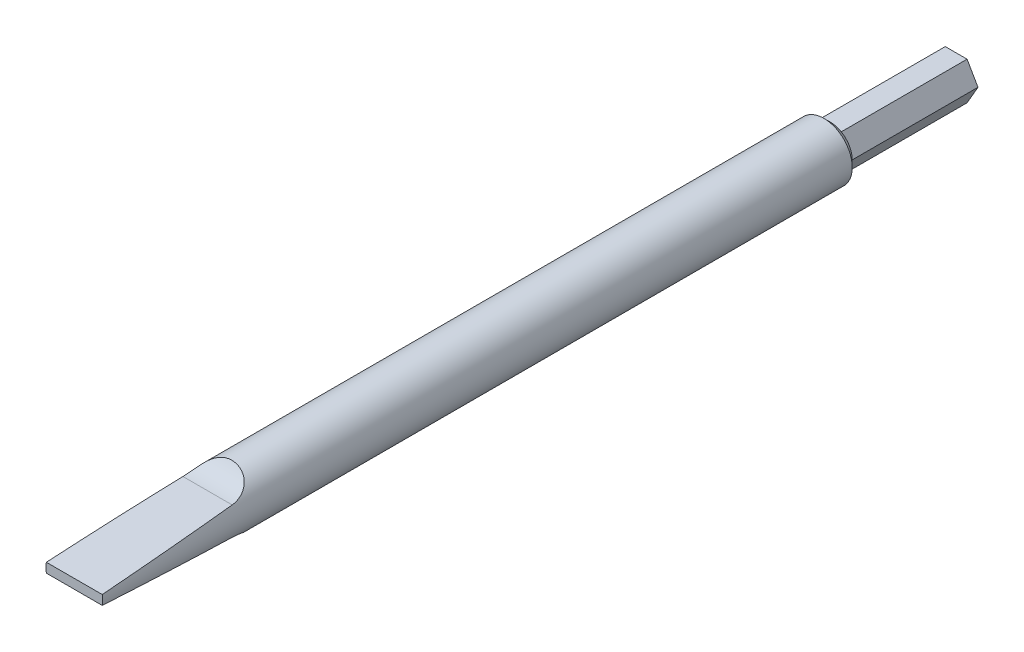
ISO-10303-21;
HEADER;
FILE_DESCRIPTION(('STEP AP214'),'2;1');
FILE_NAME('part.step','',(''),(''),'','','');
FILE_SCHEMA(('AUTOMOTIVE_DESIGN { 1 0 10303 214 1 1 1 1 }'));
ENDSEC;
DATA;
#1=APPLICATION_CONTEXT('core data for automotive mechanical design processes');
#2=APPLICATION_PROTOCOL_DEFINITION('international standard','automotive_design',2000,#1);
#3=PRODUCT_CONTEXT('',#1,'mechanical');
#4=PRODUCT('Part','Part','',(#3));
#5=PRODUCT_RELATED_PRODUCT_CATEGORY('part','',(#4));
#6=PRODUCT_DEFINITION_FORMATION('','',#4);
#7=PRODUCT_DEFINITION_CONTEXT('part definition',#1,'design');
#8=PRODUCT_DEFINITION('design','',#6,#7);
#9=PRODUCT_DEFINITION_SHAPE('','',#8);
#10=(LENGTH_UNIT() NAMED_UNIT(*) SI_UNIT(.MILLI.,.METRE.));
#11=(NAMED_UNIT(*) PLANE_ANGLE_UNIT() SI_UNIT($,.RADIAN.));
#12=(NAMED_UNIT(*) SI_UNIT($,.STERADIAN.) SOLID_ANGLE_UNIT());
#13=UNCERTAINTY_MEASURE_WITH_UNIT(LENGTH_MEASURE(1.E-05),#10,'distance_accuracy_value','');
#14=(GEOMETRIC_REPRESENTATION_CONTEXT(3) GLOBAL_UNCERTAINTY_ASSIGNED_CONTEXT((#13)) GLOBAL_UNIT_ASSIGNED_CONTEXT((#10,
#11,#12)) REPRESENTATION_CONTEXT('',''));
#15=CARTESIAN_POINT('',(0.,0.,0.));
#16=DIRECTION('',(0.,0.,1.));
#17=DIRECTION('',(1.,0.,0.));
#18=AXIS2_PLACEMENT_3D('',#15,#16,#17);
#19=CARTESIAN_POINT('',(0.,0.,120.));
#20=DIRECTION('',(0.,0.,-1.));
#21=DIRECTION('',(-1.,0.,0.));
#22=AXIS2_PLACEMENT_3D('',#19,#20,#21);
#23=CYLINDRICAL_SURFACE('',#22,4.5);
#24=CARTESIAN_POINT('',(0.,0.,1.));
#25=DIRECTION('',(0.,0.,1.));
#26=DIRECTION('',(1.,0.,0.));
#27=AXIS2_PLACEMENT_3D('',#24,#25,#26);
#28=CIRCLE('',#27,4.5);
#29=CARTESIAN_POINT('',(4.5,0.,1.));
#30=VERTEX_POINT('',#29);
#31=EDGE_CURVE('E182',#30,#30,#28,.T.);
#32=ORIENTED_EDGE('',*,*,#31,.T.);
#33=EDGE_LOOP('',(#32));
#34=FACE_BOUND('',#33,.T.);
#35=CARTESIAN_POINT('',(-3.90913794443008,-2.22904475760739,98.8486745427175));
#36=CARTESIAN_POINT('',(-3.90455301412368,-2.23702621646611,98.7342787867654));
#37=CARTESIAN_POINT('',(-3.89774124246853,-2.24897237830166,98.6202409171083));
#38=CARTESIAN_POINT('',(-3.87934716952942,-2.28058564520321,98.3935946749973));
#39=CARTESIAN_POINT('',(-3.86776339242702,-2.30025513874391,98.280986755894));
#40=CARTESIAN_POINT('',(-3.83945395370796,-2.34719584400133,98.0575363098172));
#41=CARTESIAN_POINT('',(-3.82270774842751,-2.37449738593554,97.9467027315231));
#42=CARTESIAN_POINT('',(-3.78362142886619,-2.436298436684,97.7280755292207));
#43=CARTESIAN_POINT('',(-3.76128183711757,-2.47079727307929,97.6202816222934));
#44=CARTESIAN_POINT('',(-3.71037687082037,-2.54660406210751,97.4082165609079));
#45=CARTESIAN_POINT('',(-3.68179205909014,-2.5879331727381,97.3039576056024));
#46=CARTESIAN_POINT('',(-3.61783051026291,-2.67661907337466,97.1001945116027));
#47=CARTESIAN_POINT('',(-3.58245433848763,-2.72397536155994,97.0006899780045));
#48=CARTESIAN_POINT('',(-3.50439309765484,-2.8236902240112,96.8075192575303));
#49=CARTESIAN_POINT('',(-3.46172484722608,-2.87603716753399,96.7138402977946));
#50=CARTESIAN_POINT('',(-3.36849906138687,-2.9846830410643,96.5329182426583));
#51=CARTESIAN_POINT('',(-3.31794236581186,-3.0409815500217,96.445674463597));
#52=CARTESIAN_POINT('',(-3.2123516689926,-3.15218326142481,96.2841591543176));
#53=CARTESIAN_POINT('',(-3.15786937601235,-3.20691354791847,96.2094077407047));
#54=CARTESIAN_POINT('',(-3.04161662066168,-3.31737747759323,96.0666193508308));
#55=CARTESIAN_POINT('',(-2.97984690966111,-3.37311101683262,95.9985816836744));
#56=CARTESIAN_POINT('',(-2.84907936053104,-3.48426592602755,95.8695508433399));
#57=CARTESIAN_POINT('',(-2.78008114230142,-3.53968727940563,95.8085580409603));
#58=CARTESIAN_POINT('',(-2.6351337042114,-3.64887642748707,95.6937825954873));
#59=CARTESIAN_POINT('',(-2.55918489021543,-3.70264431849602,95.6399995318489));
#60=CARTESIAN_POINT('',(-2.40814230508481,-3.80240311983273,95.5442692448825));
#61=CARTESIAN_POINT('',(-2.33362025159587,-3.84865318926925,95.5016872490807));
#62=CARTESIAN_POINT('',(-2.17966921272709,-3.93788764806116,95.4222911569372));
#63=CARTESIAN_POINT('',(-2.10023867309235,-3.98087099331313,95.3854789007471));
#64=CARTESIAN_POINT('',(-1.93704749879922,-4.06277994182616,95.3174332764952));
#65=CARTESIAN_POINT('',(-1.85328791148238,-4.10170651974433,95.2861985671095));
#66=CARTESIAN_POINT('',(-1.68196842738293,-4.17488472425591,95.229017157265));
#67=CARTESIAN_POINT('',(-1.59440708697675,-4.20913455413967,95.2030724872524));
#68=CARTESIAN_POINT('',(-1.4150627178379,-4.27279286567596,95.1559191061295));
#69=CARTESIAN_POINT('',(-1.32324199674026,-4.30213927068602,95.1347700620595));
#70=CARTESIAN_POINT('',(-1.13696065361347,-4.35507754079025,95.0973075393073));
#71=CARTESIAN_POINT('',(-1.04249914270451,-4.37866744162889,95.0809957107901));
#72=CARTESIAN_POINT('',(-0.851591587608721,-4.41976539080912,95.0529601985634));
#73=CARTESIAN_POINT('',(-0.755145476548751,-4.43727323385288,95.0412366697288));
#74=CARTESIAN_POINT('',(-0.560890393805394,-4.46598738167682,95.0221761964408));
#75=CARTESIAN_POINT('',(-0.463081368735668,-4.47719343889635,95.0148394243169));
#76=CARTESIAN_POINT('',(-0.261310371063095,-4.49360841061999,95.0041316886795));
#77=CARTESIAN_POINT('',(-0.157305834671434,-4.49845362158803,95.001001013529));
#78=CARTESIAN_POINT('',(0.050791249955018,-4.50091605877074,94.9994070035386));
#79=CARTESIAN_POINT('',(0.154883761930243,-4.49853547669683,95.0009422534408));
#80=CARTESIAN_POINT('',(0.362541163810523,-4.48657840402763,95.0087117525025));
#81=CARTESIAN_POINT('',(0.466105708581934,-4.47699769520908,95.0149487562099));
#82=CARTESIAN_POINT('',(0.671888596740988,-4.45076624447432,95.0322505562378));
#83=CARTESIAN_POINT('',(0.774107437997058,-4.43411819762719,95.0433135122668));
#84=CARTESIAN_POINT('',(0.978376392649346,-4.39361106688484,95.0707334624376));
#85=CARTESIAN_POINT('',(1.08038886357047,-4.36962505271901,95.0871840351622));
#86=CARTESIAN_POINT('',(1.28148931228229,-4.3149320162795,95.1256145106216));
#87=CARTESIAN_POINT('',(1.38057841172096,-4.28422761082077,95.1475922610158));
#88=CARTESIAN_POINT('',(1.57507265805744,-4.21660333411223,95.1974328302393));
#89=CARTESIAN_POINT('',(1.6704784246735,-4.1796845140855,95.2252946539282));
#90=CARTESIAN_POINT('',(1.8568426085362,-4.1002917134688,95.287277239646));
#91=CARTESIAN_POINT('',(1.94780125029293,-4.05781801371184,95.3213976852984));
#92=CARTESIAN_POINT('',(2.12126105031413,-3.96980587526507,95.3948568070534));
#93=CARTESIAN_POINT('',(2.20395054168733,-3.92443872232139,95.4339560171983));
#94=CARTESIAN_POINT('',(2.36394116852969,-3.8301963641651,95.5185327371687));
#95=CARTESIAN_POINT('',(2.44124045890579,-3.7813199692283,95.5640124151713));
#96=CARTESIAN_POINT('',(2.58984633123179,-3.68113041341151,95.6614341851423));
#97=CARTESIAN_POINT('',(2.66115775490605,-3.62981927482606,95.7133709699943));
#98=CARTESIAN_POINT('',(2.79750455439799,-3.52580828649944,95.8237571580949));
#99=CARTESIAN_POINT('',(2.86253769658988,-3.4731079509501,95.8822088633403));
#100=CARTESIAN_POINT('',(2.98297651089297,-3.37013542649679,96.0023647883848));
#101=CARTESIAN_POINT('',(3.03870143596111,-3.31987400410266,96.0637589014692));
#102=CARTESIAN_POINT('',(3.14423550741772,-3.22010235349993,96.1920464231747));
#103=CARTESIAN_POINT('',(3.19404255062078,-3.17059239777905,96.2589417727002));
#104=CARTESIAN_POINT('',(3.28779056711402,-3.07327174497449,96.3978454439556));
#105=CARTESIAN_POINT('',(3.33173282550277,-3.02546067731882,96.4698526402567));
#106=CARTESIAN_POINT('',(3.41397726201645,-2.93234054623073,96.6185905027541));
#107=CARTESIAN_POINT('',(3.45227737571842,-2.88703240237242,96.6953228833739));
#108=CARTESIAN_POINT('',(3.52457291290428,-2.79834911591695,96.855377294842));
#109=CARTESIAN_POINT('',(3.55840449081346,-2.75507290609889,96.9388280265469));
#110=CARTESIAN_POINT('',(3.62074796646077,-2.67261260417686,97.109689319816));
#111=CARTESIAN_POINT('',(3.64925750881822,-2.63343032729214,97.1971016134856));
#112=CARTESIAN_POINT('',(3.70134563535071,-2.55970296754422,97.3753297429375));
#113=CARTESIAN_POINT('',(3.72492197992573,-2.52515999339455,97.4661471026037));
#114=CARTESIAN_POINT('',(3.76751692246678,-2.46115721426346,97.6505978419934));
#115=CARTESIAN_POINT('',(3.7865354465755,-2.43169749165585,97.7442312673222));
#116=CARTESIAN_POINT('',(3.81804381376264,-2.38186601038426,97.9207414664065));
#117=CARTESIAN_POINT('',(3.83107165117266,-2.36080172872799,98.0033285244547));
#118=CARTESIAN_POINT('',(3.85419730016856,-2.32285508466957,98.1698579279807));
#119=CARTESIAN_POINT('',(3.86429528366966,-2.30597247690759,98.2538001936336));
#120=CARTESIAN_POINT('',(3.88170608285833,-2.27654460459327,98.4225084552288));
#121=CARTESIAN_POINT('',(3.88902574489354,-2.26398868533907,98.5072718914801));
#122=CARTESIAN_POINT('',(3.90102964912072,-2.24323185058371,98.6775140433748));
#123=CARTESIAN_POINT('',(3.90571394949778,-2.23503083893253,98.7629927431838));
#124=CARTESIAN_POINT('',(3.90913794443008,-2.22904475760738,98.8486745427175));
#125=B_SPLINE_CURVE_WITH_KNOTS('',3,(#35,#36,#37,#38,#39,#40,#41,#42,#43,#44,#45,#46,#47,#48,
#49,#50,#51,#52,#53,#54,#55,#56,#57,#58,#59,#60,#61,#62,#63,#64,#65,#66,#67,#68,#69,#70,#71,#72,
#73,#74,#75,#76,#77,#78,#79,#80,#81,#82,#83,#84,#85,#86,#87,#88,#89,#90,#91,#92,#93,#94,#95,#96,
#97,#98,#99,#100,#101,#102,#103,#104,#105,#106,#107,#108,#109,#110,#111,#112,#113,#114,#115,
#116,#117,#118,#119,#120,#121,#122,#123,#124),.UNSPECIFIED.,.F.,.F.,(4,2,2,2,2,2,2,2,2,2,2,2,2,
2,2,2,2,2,2,2,2,2,2,2,2,2,2,2,2,2,2,2,2,2,2,2,2,2,2,2,2,2,2,2,4),(0.,0.344218673375672,
0.688543881854524,1.03425740296899,1.37993863968712,1.7267114781845,2.07345546336158,
2.41941024420027,2.76532821840729,3.08731527466596,3.40926916138795,3.7312399860742,
4.05319202197876,4.34533978740256,4.63758053917147,4.9297509160951,5.22203322490096,
5.51777376437477,5.81361507685571,6.10946637439177,6.40532929339913,6.71746313275976,
7.02950230584357,7.34172443098342,7.65382759968232,7.97166795893523,8.28938473897319,
8.60704782832532,8.92469486407721,9.23060206706399,9.53661347476197,9.84237501312737,
10.1482449345382,10.4387759573691,10.7294099265599,11.0199801067686,11.3106563419917,
11.6100631974403,11.909602249263,12.2092769938196,12.5089565941335,12.7674602840362,
13.0259488026335,13.283796152694,13.5416378096236),.UNSPECIFIED.);
#126=CARTESIAN_POINT('',(-3.90913794443008,-2.22904475760739,98.8486745427175));
#127=VERTEX_POINT('',#126);
#128=CARTESIAN_POINT('',(3.90913794443008,-2.22904475760739,98.8486745427175));
#129=VERTEX_POINT('',#128);
#130=EDGE_CURVE('E11',#127,#129,#125,.T.);
#131=ORIENTED_EDGE('',*,*,#130,.F.);
#132=CARTESIAN_POINT('',(0.,0.,130.725499692534));
#133=DIRECTION('',(0.,0.997564050259824,-0.0697564737441254));
#134=DIRECTION('',(0.,-0.0697564737441254,-0.997564050259824));
#135=AXIS2_PLACEMENT_3D('',#132,#133,#134);
#136=ELLIPSE('',#135,64.5101416179164,4.5);
#137=CARTESIAN_POINT('',(-4.43705983732472,-0.75,120.));
#138=VERTEX_POINT('',#137);
#139=EDGE_CURVE('E246',#127,#138,#136,.T.);
#140=ORIENTED_EDGE('',*,*,#139,.T.);
#141=CARTESIAN_POINT('',(0.,0.,120.));
#142=DIRECTION('',(0.,0.,1.));
#143=DIRECTION('',(1.,0.,0.));
#144=AXIS2_PLACEMENT_3D('',#141,#142,#143);
#145=CIRCLE('',#144,4.5);
#146=CARTESIAN_POINT('',(-4.43705983732472,0.75,120.));
#147=VERTEX_POINT('',#146);
#148=EDGE_CURVE('E161',#147,#138,#145,.T.);
#149=ORIENTED_EDGE('',*,*,#148,.F.);
#150=CARTESIAN_POINT('',(0.,0.,130.725499692534));
#151=DIRECTION('',(0.,0.997564050259824,0.0697564737441254));
#152=DIRECTION('',(0.,0.0697564737441255,-0.997564050259824));
#153=AXIS2_PLACEMENT_3D('',#150,#151,#152);
#154=ELLIPSE('',#153,64.5101416179164,4.5);
#155=CARTESIAN_POINT('',(-3.90913794443008,2.22904475760739,98.8486745427175));
#156=VERTEX_POINT('',#155);
#157=EDGE_CURVE('E272',#156,#147,#154,.T.);
#158=ORIENTED_EDGE('',*,*,#157,.F.);
#159=CARTESIAN_POINT('',(-3.90913794443008,2.22904475760739,98.8486745427175));
#160=CARTESIAN_POINT('',(-3.90455301412368,2.23702621646611,98.7342787867654));
#161=CARTESIAN_POINT('',(-3.89774124246853,2.24897237830166,98.6202409171083));
#162=CARTESIAN_POINT('',(-3.87934716952942,2.28058564520321,98.3935946749973));
#163=CARTESIAN_POINT('',(-3.86776339242702,2.30025513874391,98.280986755894));
#164=CARTESIAN_POINT('',(-3.83945395370796,2.34719584400133,98.0575363098172));
#165=CARTESIAN_POINT('',(-3.82270774842751,2.37449738593554,97.9467027315231));
#166=CARTESIAN_POINT('',(-3.78362142886619,2.436298436684,97.7280755292207));
#167=CARTESIAN_POINT('',(-3.76128183711757,2.47079727307929,97.6202816222934));
#168=CARTESIAN_POINT('',(-3.71037687082037,2.54660406210751,97.4082165609079));
#169=CARTESIAN_POINT('',(-3.68179205909014,2.5879331727381,97.3039576056024));
#170=CARTESIAN_POINT('',(-3.61783051026291,2.67661907337466,97.1001945116027));
#171=CARTESIAN_POINT('',(-3.58245433848763,2.72397536155994,97.0006899780045));
#172=CARTESIAN_POINT('',(-3.50439309765484,2.8236902240112,96.8075192575303));
#173=CARTESIAN_POINT('',(-3.46172484722608,2.87603716753399,96.7138402977946));
#174=CARTESIAN_POINT('',(-3.36849906138687,2.9846830410643,96.5329182426583));
#175=CARTESIAN_POINT('',(-3.31794236581186,3.0409815500217,96.445674463597));
#176=CARTESIAN_POINT('',(-3.2123516689926,3.15218326142481,96.2841591543176));
#177=CARTESIAN_POINT('',(-3.15786937601235,3.20691354791847,96.2094077407047));
#178=CARTESIAN_POINT('',(-3.04161662066168,3.31737747759323,96.0666193508308));
#179=CARTESIAN_POINT('',(-2.97984690966111,3.37311101683262,95.9985816836744));
#180=CARTESIAN_POINT('',(-2.84907936053104,3.48426592602755,95.8695508433399));
#181=CARTESIAN_POINT('',(-2.78008114230142,3.53968727940563,95.8085580409603));
#182=CARTESIAN_POINT('',(-2.6351337042114,3.64887642748707,95.6937825954873));
#183=CARTESIAN_POINT('',(-2.55918489021543,3.70264431849602,95.6399995318489));
#184=CARTESIAN_POINT('',(-2.40814230508481,3.80240311983273,95.5442692448825));
#185=CARTESIAN_POINT('',(-2.33362025159587,3.84865318926925,95.5016872490807));
#186=CARTESIAN_POINT('',(-2.17966921272709,3.93788764806116,95.4222911569372));
#187=CARTESIAN_POINT('',(-2.10023867309235,3.98087099331313,95.3854789007471));
#188=CARTESIAN_POINT('',(-1.93704749879922,4.06277994182616,95.3174332764952));
#189=CARTESIAN_POINT('',(-1.85328791148238,4.10170651974433,95.2861985671095));
#190=CARTESIAN_POINT('',(-1.68196842738293,4.17488472425591,95.229017157265));
#191=CARTESIAN_POINT('',(-1.59440708697675,4.20913455413967,95.2030724872524));
#192=CARTESIAN_POINT('',(-1.4150627178379,4.27279286567596,95.1559191061295));
#193=CARTESIAN_POINT('',(-1.32324199674026,4.30213927068602,95.1347700620595));
#194=CARTESIAN_POINT('',(-1.13696065361347,4.35507754079025,95.0973075393073));
#195=CARTESIAN_POINT('',(-1.04249914270451,4.37866744162889,95.0809957107901));
#196=CARTESIAN_POINT('',(-0.851591587608721,4.41976539080912,95.0529601985634));
#197=CARTESIAN_POINT('',(-0.755145476548751,4.43727323385288,95.0412366697288));
#198=CARTESIAN_POINT('',(-0.560890393805394,4.46598738167682,95.0221761964408));
#199=CARTESIAN_POINT('',(-0.463081368735668,4.47719343889635,95.0148394243169));
#200=CARTESIAN_POINT('',(-0.261310371063095,4.49360841061999,95.0041316886795));
#201=CARTESIAN_POINT('',(-0.157305834671434,4.49845362158803,95.001001013529));
#202=CARTESIAN_POINT('',(0.050791249955018,4.50091605877074,94.9994070035386));
#203=CARTESIAN_POINT('',(0.154883761930243,4.49853547669683,95.0009422534408));
#204=CARTESIAN_POINT('',(0.362541163810523,4.48657840402763,95.0087117525025));
#205=CARTESIAN_POINT('',(0.466105708581934,4.47699769520908,95.0149487562099));
#206=CARTESIAN_POINT('',(0.671888596740988,4.45076624447432,95.0322505562378));
#207=CARTESIAN_POINT('',(0.774107437997058,4.43411819762719,95.0433135122668));
#208=CARTESIAN_POINT('',(0.978376392649346,4.39361106688484,95.0707334624376));
#209=CARTESIAN_POINT('',(1.08038886357047,4.36962505271901,95.0871840351622));
#210=CARTESIAN_POINT('',(1.28148931228229,4.3149320162795,95.1256145106216));
#211=CARTESIAN_POINT('',(1.38057841172096,4.28422761082077,95.1475922610158));
#212=CARTESIAN_POINT('',(1.57507265805744,4.21660333411223,95.1974328302393));
#213=CARTESIAN_POINT('',(1.6704784246735,4.1796845140855,95.2252946539282));
#214=CARTESIAN_POINT('',(1.8568426085362,4.1002917134688,95.287277239646));
#215=CARTESIAN_POINT('',(1.94780125029293,4.05781801371184,95.3213976852984));
#216=CARTESIAN_POINT('',(2.12126105031413,3.96980587526507,95.3948568070534));
#217=CARTESIAN_POINT('',(2.20395054168733,3.92443872232139,95.4339560171983));
#218=CARTESIAN_POINT('',(2.36394116852969,3.8301963641651,95.5185327371687));
#219=CARTESIAN_POINT('',(2.44124045890579,3.7813199692283,95.5640124151713));
#220=CARTESIAN_POINT('',(2.58984633123179,3.68113041341151,95.6614341851423));
#221=CARTESIAN_POINT('',(2.66115775490605,3.62981927482606,95.7133709699943));
#222=CARTESIAN_POINT('',(2.79750455439799,3.52580828649944,95.8237571580949));
#223=CARTESIAN_POINT('',(2.86253769658988,3.4731079509501,95.8822088633403));
#224=CARTESIAN_POINT('',(2.98297651089297,3.37013542649679,96.0023647883848));
#225=CARTESIAN_POINT('',(3.03870143596111,3.31987400410266,96.0637589014692));
#226=CARTESIAN_POINT('',(3.14423550741772,3.22010235349993,96.1920464231747));
#227=CARTESIAN_POINT('',(3.19404255062078,3.17059239777905,96.2589417727002));
#228=CARTESIAN_POINT('',(3.28779056711402,3.07327174497449,96.3978454439556));
#229=CARTESIAN_POINT('',(3.33173282550277,3.02546067731882,96.4698526402567));
#230=CARTESIAN_POINT('',(3.41397726201645,2.93234054623073,96.6185905027541));
#231=CARTESIAN_POINT('',(3.45227737571842,2.88703240237242,96.6953228833739));
#232=CARTESIAN_POINT('',(3.52457291290428,2.79834911591695,96.855377294842));
#233=CARTESIAN_POINT('',(3.55840449081346,2.75507290609889,96.9388280265469));
#234=CARTESIAN_POINT('',(3.62074796646077,2.67261260417686,97.109689319816));
#235=CARTESIAN_POINT('',(3.64925750881822,2.63343032729214,97.1971016134856));
#236=CARTESIAN_POINT('',(3.70134563535071,2.55970296754422,97.3753297429375));
#237=CARTESIAN_POINT('',(3.72492197992573,2.52515999339455,97.4661471026037));
#238=CARTESIAN_POINT('',(3.76751692246678,2.46115721426346,97.6505978419934));
#239=CARTESIAN_POINT('',(3.7865354465755,2.43169749165585,97.7442312673222));
#240=CARTESIAN_POINT('',(3.81804381376264,2.38186601038426,97.9207414664065));
#241=CARTESIAN_POINT('',(3.83107165117266,2.36080172872799,98.0033285244547));
#242=CARTESIAN_POINT('',(3.85419730016856,2.32285508466957,98.1698579279807));
#243=CARTESIAN_POINT('',(3.86429528366966,2.30597247690759,98.2538001936336));
#244=CARTESIAN_POINT('',(3.88170608285833,2.27654460459327,98.4225084552288));
#245=CARTESIAN_POINT('',(3.88902574489354,2.26398868533907,98.5072718914801));
#246=CARTESIAN_POINT('',(3.90102964912072,2.24323185058371,98.6775140433748));
#247=CARTESIAN_POINT('',(3.90571394949778,2.23503083893253,98.7629927431838));
#248=CARTESIAN_POINT('',(3.90913794443008,2.22904475760738,98.8486745427175));
#249=B_SPLINE_CURVE_WITH_KNOTS('',3,(#159,#160,#161,#162,#163,#164,#165,#166,#167,#168,#169,
#170,#171,#172,#173,#174,#175,#176,#177,#178,#179,#180,#181,#182,#183,#184,#185,#186,#187,#188,
#189,#190,#191,#192,#193,#194,#195,#196,#197,#198,#199,#200,#201,#202,#203,#204,#205,#206,#207,
#208,#209,#210,#211,#212,#213,#214,#215,#216,#217,#218,#219,#220,#221,#222,#223,#224,#225,#226,
#227,#228,#229,#230,#231,#232,#233,#234,#235,#236,#237,#238,#239,#240,#241,#242,#243,#244,#245,
#246,#247,#248),.UNSPECIFIED.,.F.,.F.,(4,2,2,2,2,2,2,2,2,2,2,2,2,2,2,2,2,2,2,2,2,2,2,2,2,2,2,2,
2,2,2,2,2,2,2,2,2,2,2,2,2,2,2,2,4),(0.,0.344218673375672,0.688543881854524,1.03425740296899,
1.37993863968712,1.7267114781845,2.07345546336158,2.41941024420027,2.76532821840729,
3.08731527466596,3.40926916138795,3.7312399860742,4.05319202197876,4.34533978740256,
4.63758053917147,4.9297509160951,5.22203322490096,5.51777376437477,5.81361507685571,
6.10946637439177,6.40532929339913,6.71746313275976,7.02950230584357,7.34172443098342,
7.65382759968232,7.97166795893523,8.28938473897319,8.60704782832532,8.92469486407721,
9.23060206706399,9.53661347476197,9.84237501312737,10.1482449345382,10.4387759573691,
10.7294099265599,11.0199801067686,11.3106563419917,11.6100631974403,11.909602249263,
12.2092769938196,12.5089565941335,12.7674602840362,13.0259488026335,13.283796152694,
13.5416378096236),.UNSPECIFIED.);
#250=CARTESIAN_POINT('',(3.90913794443008,2.22904475760739,98.8486745427175));
#251=VERTEX_POINT('',#250);
#252=EDGE_CURVE('E63',#156,#251,#249,.T.);
#253=ORIENTED_EDGE('',*,*,#252,.T.);
#254=CARTESIAN_POINT('',(4.43705983732472,0.75,120.));
#255=VERTEX_POINT('',#254);
#256=EDGE_CURVE('E270',#255,#251,#154,.T.);
#257=ORIENTED_EDGE('',*,*,#256,.F.);
#258=CARTESIAN_POINT('',(4.43705983732472,-0.75,120.));
#259=VERTEX_POINT('',#258);
#260=EDGE_CURVE('E262',#259,#255,#145,.T.);
#261=ORIENTED_EDGE('',*,*,#260,.F.);
#262=EDGE_CURVE('E252',#259,#129,#136,.T.);
#263=ORIENTED_EDGE('',*,*,#262,.T.);
#264=EDGE_LOOP('',(#131,#140,#149,#158,#253,#257,#261,#263));
#265=FACE_BOUND('',#264,.T.);
#266=ADVANCED_FACE('F47',(#34,#265),#23,.T.);
#267=CARTESIAN_POINT('',(0.,0.,120.));
#268=DIRECTION('',(0.,0.,1.));
#269=DIRECTION('',(1.,0.,0.));
#270=AXIS2_PLACEMENT_3D('',#267,#268,#269);
#271=PLANE('',#270);
#272=DIRECTION('',(-1.,0.,0.));
#273=VECTOR('',#272,1.);
#274=CARTESIAN_POINT('',(120.,-0.75,120.));
#275=LINE('',#274,#273);
#276=EDGE_CURVE('E210',#259,#138,#275,.T.);
#277=ORIENTED_EDGE('',*,*,#276,.F.);
#278=ORIENTED_EDGE('',*,*,#260,.T.);
#279=DIRECTION('',(-1.,0.,0.));
#280=VECTOR('',#279,1.);
#281=CARTESIAN_POINT('',(120.,0.75,120.));
#282=LINE('',#281,#280);
#283=EDGE_CURVE('E198',#255,#147,#282,.T.);
#284=ORIENTED_EDGE('',*,*,#283,.T.);
#285=ORIENTED_EDGE('',*,*,#148,.T.);
#286=EDGE_LOOP('',(#277,#278,#284,#285));
#287=FACE_BOUND('',#286,.T.);
#288=ADVANCED_FACE('F217',(#287),#271,.T.);
#289=CARTESIAN_POINT('',(2.59807621135332,-1.5,-20.));
#290=DIRECTION('',(0.866025403784439,-0.5,0.));
#291=DIRECTION('',(0.5,0.866025403784439,0.));
#292=AXIS2_PLACEMENT_3D('',#289,#290,#291);
#293=PLANE('',#292);
#294=DIRECTION('',(0.5,0.866025403784439,0.));
#295=VECTOR('',#294,1.);
#296=CARTESIAN_POINT('',(2.59807621135332,-1.5,0.));
#297=LINE('',#296,#295);
#298=CARTESIAN_POINT('',(1.73205080756888,-3.,0.));
#299=VERTEX_POINT('',#298);
#300=CARTESIAN_POINT('',(3.46410161513775,0.,0.));
#301=VERTEX_POINT('',#300);
#302=EDGE_CURVE('E158',#299,#301,#297,.T.);
#303=ORIENTED_EDGE('',*,*,#302,.F.);
#304=DIRECTION('',(0.,0.,1.));
#305=VECTOR('',#304,1.);
#306=CARTESIAN_POINT('',(1.73205080756888,-3.,-20.));
#307=LINE('',#306,#305);
#308=CARTESIAN_POINT('',(1.73205080756888,-3.,-20.));
#309=VERTEX_POINT('',#308);
#310=EDGE_CURVE('E78',#309,#299,#307,.T.);
#311=ORIENTED_EDGE('',*,*,#310,.F.);
#312=DIRECTION('',(0.5,0.866025403784439,0.));
#313=VECTOR('',#312,1.);
#314=CARTESIAN_POINT('',(2.59807621135332,-1.5,-20.));
#315=LINE('',#314,#313);
#316=CARTESIAN_POINT('',(3.46410161513775,0.,-20.));
#317=VERTEX_POINT('',#316);
#318=EDGE_CURVE('E179',#309,#317,#315,.T.);
#319=ORIENTED_EDGE('',*,*,#318,.T.);
#320=DIRECTION('',(0.,0.,1.));
#321=VECTOR('',#320,1.);
#322=CARTESIAN_POINT('',(3.46410161513775,0.,-20.));
#323=LINE('',#322,#321);
#324=EDGE_CURVE('E113',#317,#301,#323,.T.);
#325=ORIENTED_EDGE('',*,*,#324,.T.);
#326=EDGE_LOOP('',(#303,#311,#319,#325));
#327=FACE_BOUND('',#326,.T.);
#328=ADVANCED_FACE('F219',(#327),#293,.T.);
#329=CARTESIAN_POINT('',(0.,-3.,-20.));
#330=DIRECTION('',(0.,-1.,0.));
#331=DIRECTION('',(0.,0.,-1.));
#332=AXIS2_PLACEMENT_3D('',#329,#330,#331);
#333=PLANE('',#332);
#334=DIRECTION('',(1.,0.,0.));
#335=VECTOR('',#334,1.);
#336=CARTESIAN_POINT('',(0.,-3.,0.));
#337=LINE('',#336,#335);
#338=CARTESIAN_POINT('',(-1.73205080756887,-3.,0.));
#339=VERTEX_POINT('',#338);
#340=EDGE_CURVE('E176',#339,#299,#337,.T.);
#341=ORIENTED_EDGE('',*,*,#340,.F.);
#342=DIRECTION('',(0.,0.,1.));
#343=VECTOR('',#342,1.);
#344=CARTESIAN_POINT('',(-1.73205080756887,-3.,-20.));
#345=LINE('',#344,#343);
#346=CARTESIAN_POINT('',(-1.73205080756887,-3.,-20.));
#347=VERTEX_POINT('',#346);
#348=EDGE_CURVE('E102',#347,#339,#345,.T.);
#349=ORIENTED_EDGE('',*,*,#348,.F.);
#350=DIRECTION('',(1.,0.,0.));
#351=VECTOR('',#350,1.);
#352=CARTESIAN_POINT('',(0.,-3.,-20.));
#353=LINE('',#352,#351);
#354=EDGE_CURVE('E144',#347,#309,#353,.T.);
#355=ORIENTED_EDGE('',*,*,#354,.T.);
#356=ORIENTED_EDGE('',*,*,#310,.T.);
#357=EDGE_LOOP('',(#341,#349,#355,#356));
#358=FACE_BOUND('',#357,.T.);
#359=ADVANCED_FACE('F290',(#358),#333,.T.);
#360=CARTESIAN_POINT('',(-2.59807621135331,-1.5,-20.));
#361=DIRECTION('',(-0.866025403784438,-0.5,0.));
#362=DIRECTION('',(0.5,-0.866025403784438,0.));
#363=AXIS2_PLACEMENT_3D('',#360,#361,#362);
#364=PLANE('',#363);
#365=DIRECTION('',(0.5,-0.866025403784438,0.));
#366=VECTOR('',#365,1.);
#367=CARTESIAN_POINT('',(-2.59807621135331,-1.5,0.));
#368=LINE('',#367,#366);
#369=CARTESIAN_POINT('',(-3.46410161513775,0.,0.));
#370=VERTEX_POINT('',#369);
#371=EDGE_CURVE('E126',#370,#339,#368,.T.);
#372=ORIENTED_EDGE('',*,*,#371,.F.);
#373=DIRECTION('',(0.,0.,1.));
#374=VECTOR('',#373,1.);
#375=CARTESIAN_POINT('',(-3.46410161513775,0.,-20.));
#376=LINE('',#375,#374);
#377=CARTESIAN_POINT('',(-3.46410161513775,0.,-20.));
#378=VERTEX_POINT('',#377);
#379=EDGE_CURVE('E124',#378,#370,#376,.T.);
#380=ORIENTED_EDGE('',*,*,#379,.F.);
#381=DIRECTION('',(0.5,-0.866025403784438,0.));
#382=VECTOR('',#381,1.);
#383=CARTESIAN_POINT('',(-2.59807621135331,-1.5,-20.));
#384=LINE('',#383,#382);
#385=EDGE_CURVE('E127',#378,#347,#384,.T.);
#386=ORIENTED_EDGE('',*,*,#385,.T.);
#387=ORIENTED_EDGE('',*,*,#348,.T.);
#388=EDGE_LOOP('',(#372,#380,#386,#387));
#389=FACE_BOUND('',#388,.T.);
#390=ADVANCED_FACE('F123',(#389),#364,.T.);
#391=CARTESIAN_POINT('',(-2.59807621135332,1.5,-20.));
#392=DIRECTION('',(-0.866025403784439,0.5,0.));
#393=DIRECTION('',(-0.5,-0.866025403784439,0.));
#394=AXIS2_PLACEMENT_3D('',#391,#392,#393);
#395=PLANE('',#394);
#396=DIRECTION('',(-0.5,-0.866025403784439,0.));
#397=VECTOR('',#396,1.);
#398=CARTESIAN_POINT('',(-2.59807621135332,1.5,0.));
#399=LINE('',#398,#397);
#400=CARTESIAN_POINT('',(-1.73205080756888,3.,0.));
#401=VERTEX_POINT('',#400);
#402=EDGE_CURVE('E171',#401,#370,#399,.T.);
#403=ORIENTED_EDGE('',*,*,#402,.F.);
#404=DIRECTION('',(0.,0.,1.));
#405=VECTOR('',#404,1.);
#406=CARTESIAN_POINT('',(-1.73205080756888,3.,-20.));
#407=LINE('',#406,#405);
#408=CARTESIAN_POINT('',(-1.73205080756888,3.,-20.));
#409=VERTEX_POINT('',#408);
#410=EDGE_CURVE('E134',#409,#401,#407,.T.);
#411=ORIENTED_EDGE('',*,*,#410,.F.);
#412=DIRECTION('',(-0.5,-0.866025403784439,0.));
#413=VECTOR('',#412,1.);
#414=CARTESIAN_POINT('',(-2.59807621135332,1.5,-20.));
#415=LINE('',#414,#413);
#416=EDGE_CURVE('E142',#409,#378,#415,.T.);
#417=ORIENTED_EDGE('',*,*,#416,.T.);
#418=ORIENTED_EDGE('',*,*,#379,.T.);
#419=EDGE_LOOP('',(#403,#411,#417,#418));
#420=FACE_BOUND('',#419,.T.);
#421=ADVANCED_FACE('F150',(#420),#395,.T.);
#422=CARTESIAN_POINT('',(0.,3.,-20.));
#423=DIRECTION('',(0.,1.,0.));
#424=DIRECTION('',(-1.,0.,0.));
#425=AXIS2_PLACEMENT_3D('',#422,#423,#424);
#426=PLANE('',#425);
#427=DIRECTION('',(-1.,0.,0.));
#428=VECTOR('',#427,1.);
#429=CARTESIAN_POINT('',(0.,3.,0.));
#430=LINE('',#429,#428);
#431=CARTESIAN_POINT('',(1.73205080756888,3.,0.));
#432=VERTEX_POINT('',#431);
#433=EDGE_CURVE('E170',#432,#401,#430,.T.);
#434=ORIENTED_EDGE('',*,*,#433,.F.);
#435=DIRECTION('',(0.,0.,1.));
#436=VECTOR('',#435,1.);
#437=CARTESIAN_POINT('',(1.73205080756888,3.,-20.));
#438=LINE('',#437,#436);
#439=CARTESIAN_POINT('',(1.73205080756888,3.,-20.));
#440=VERTEX_POINT('',#439);
#441=EDGE_CURVE('E189',#440,#432,#438,.T.);
#442=ORIENTED_EDGE('',*,*,#441,.F.);
#443=DIRECTION('',(-1.,0.,0.));
#444=VECTOR('',#443,1.);
#445=CARTESIAN_POINT('',(0.,3.,-20.));
#446=LINE('',#445,#444);
#447=EDGE_CURVE('E146',#440,#409,#446,.T.);
#448=ORIENTED_EDGE('',*,*,#447,.T.);
#449=ORIENTED_EDGE('',*,*,#410,.T.);
#450=EDGE_LOOP('',(#434,#442,#448,#449));
#451=FACE_BOUND('',#450,.T.);
#452=ADVANCED_FACE('F296',(#451),#426,.T.);
#453=CARTESIAN_POINT('',(2.59807621135332,1.5,-20.));
#454=DIRECTION('',(0.866025403784439,0.5,0.));
#455=DIRECTION('',(-0.5,0.866025403784439,0.));
#456=AXIS2_PLACEMENT_3D('',#453,#454,#455);
#457=PLANE('',#456);
#458=DIRECTION('',(-0.5,0.866025403784439,0.));
#459=VECTOR('',#458,1.);
#460=CARTESIAN_POINT('',(2.59807621135332,1.5,0.));
#461=LINE('',#460,#459);
#462=EDGE_CURVE('E162',#301,#432,#461,.T.);
#463=ORIENTED_EDGE('',*,*,#462,.F.);
#464=ORIENTED_EDGE('',*,*,#324,.F.);
#465=DIRECTION('',(-0.5,0.866025403784439,0.));
#466=VECTOR('',#465,1.);
#467=CARTESIAN_POINT('',(2.59807621135332,1.5,-20.));
#468=LINE('',#467,#466);
#469=EDGE_CURVE('E155',#317,#440,#468,.T.);
#470=ORIENTED_EDGE('',*,*,#469,.T.);
#471=ORIENTED_EDGE('',*,*,#441,.T.);
#472=EDGE_LOOP('',(#463,#464,#470,#471));
#473=FACE_BOUND('',#472,.T.);
#474=ADVANCED_FACE('F233',(#473),#457,.T.);
#475=CARTESIAN_POINT('',(0.,0.,-20.));
#476=DIRECTION('',(0.,0.,1.));
#477=DIRECTION('',(1.,0.,0.));
#478=AXIS2_PLACEMENT_3D('',#475,#476,#477);
#479=PLANE('',#478);
#480=ORIENTED_EDGE('',*,*,#318,.F.);
#481=ORIENTED_EDGE('',*,*,#354,.F.);
#482=ORIENTED_EDGE('',*,*,#385,.F.);
#483=ORIENTED_EDGE('',*,*,#416,.F.);
#484=ORIENTED_EDGE('',*,*,#447,.F.);
#485=ORIENTED_EDGE('',*,*,#469,.F.);
#486=EDGE_LOOP('',(#480,#481,#482,#483,#484,#485));
#487=FACE_BOUND('',#486,.T.);
#488=ADVANCED_FACE('F137',(#487),#479,.F.);
#489=CARTESIAN_POINT('',(0.,0.,0.));
#490=DIRECTION('',(0.,0.,1.));
#491=DIRECTION('',(1.,0.,0.));
#492=AXIS2_PLACEMENT_3D('',#489,#490,#491);
#493=PLANE('',#492);
#494=CARTESIAN_POINT('',(0.,0.,0.));
#495=DIRECTION('',(0.,0.,1.));
#496=DIRECTION('',(1.,0.,0.));
#497=AXIS2_PLACEMENT_3D('',#494,#495,#496);
#498=CIRCLE('',#497,3.49999999999999);
#499=CARTESIAN_POINT('',(3.49999999999999,0.,0.));
#500=VERTEX_POINT('',#499);
#501=EDGE_CURVE('E196',#500,#500,#498,.F.);
#502=ORIENTED_EDGE('',*,*,#501,.T.);
#503=EDGE_LOOP('',(#502));
#504=FACE_BOUND('',#503,.T.);
#505=ORIENTED_EDGE('',*,*,#340,.T.);
#506=ORIENTED_EDGE('',*,*,#302,.T.);
#507=ORIENTED_EDGE('',*,*,#462,.T.);
#508=ORIENTED_EDGE('',*,*,#433,.T.);
#509=ORIENTED_EDGE('',*,*,#402,.T.);
#510=ORIENTED_EDGE('',*,*,#371,.T.);
#511=EDGE_LOOP('',(#505,#506,#507,#508,#509,#510));
#512=FACE_BOUND('',#511,.T.);
#513=ADVANCED_FACE('F225',(#504,#512),#493,.F.);
#514=CARTESIAN_POINT('',(0.,0.,1.));
#515=DIRECTION('',(0.,0.,1.));
#516=DIRECTION('',(1.,0.,0.));
#517=AXIS2_PLACEMENT_3D('',#514,#515,#516);
#518=CONICAL_SURFACE('',#517,4.5,0.785398163397453);
#519=ORIENTED_EDGE('',*,*,#501,.F.);
#520=EDGE_LOOP('',(#519));
#521=FACE_BOUND('',#520,.T.);
#522=ORIENTED_EDGE('',*,*,#31,.F.);
#523=EDGE_LOOP('',(#522));
#524=FACE_BOUND('',#523,.T.);
#525=ADVANCED_FACE('F55',(#521,#524),#518,.T.);
#526=CARTESIAN_POINT('',(120.,7.21686500890651,99.1974569114381));
#527=DIRECTION('',(-1.,0.,0.));
#528=DIRECTION('',(0.,0.,1.));
#529=AXIS2_PLACEMENT_3D('',#526,#527,#528);
#530=CYLINDRICAL_SURFACE('',#529,5.);
#531=DIRECTION('',(-1.,0.,0.));
#532=VECTOR('',#531,1.);
#533=CARTESIAN_POINT('',(120.,2.22904475760739,98.8486745427175));
#534=LINE('',#533,#532);
#535=EDGE_CURVE('E71',#251,#156,#534,.T.);
#536=ORIENTED_EDGE('',*,*,#535,.F.);
#537=ORIENTED_EDGE('',*,*,#252,.F.);
#538=EDGE_LOOP('',(#536,#537));
#539=FACE_BOUND('',#538,.T.);
#540=ADVANCED_FACE('F212',(#539),#530,.F.);
#541=CARTESIAN_POINT('',(120.,0.75,120.));
#542=DIRECTION('',(0.,0.997564050259824,0.0697564737441254));
#543=DIRECTION('',(0.,-0.0697564737441255,0.997564050259824));
#544=AXIS2_PLACEMENT_3D('',#541,#542,#543);
#545=PLANE('',#544);
#546=ORIENTED_EDGE('',*,*,#157,.T.);
#547=ORIENTED_EDGE('',*,*,#283,.F.);
#548=ORIENTED_EDGE('',*,*,#256,.T.);
#549=ORIENTED_EDGE('',*,*,#535,.T.);
#550=EDGE_LOOP('',(#546,#547,#548,#549));
#551=FACE_BOUND('',#550,.T.);
#552=ADVANCED_FACE('F216',(#551),#545,.T.);
#553=CARTESIAN_POINT('',(120.,-7.21686500890651,99.1974569114381));
#554=DIRECTION('',(-1.,0.,0.));
#555=DIRECTION('',(0.,0.,1.));
#556=AXIS2_PLACEMENT_3D('',#553,#554,#555);
#557=CYLINDRICAL_SURFACE('',#556,5.);
#558=DIRECTION('',(-1.,0.,0.));
#559=VECTOR('',#558,1.);
#560=CARTESIAN_POINT('',(120.,-2.22904475760739,98.8486745427175));
#561=LINE('',#560,#559);
#562=EDGE_CURVE('E258',#129,#127,#561,.T.);
#563=ORIENTED_EDGE('',*,*,#562,.T.);
#564=ORIENTED_EDGE('',*,*,#130,.T.);
#565=EDGE_LOOP('',(#563,#564));
#566=FACE_BOUND('',#565,.T.);
#567=ADVANCED_FACE('F264',(#566),#557,.F.);
#568=CARTESIAN_POINT('',(120.,-0.75,120.));
#569=DIRECTION('',(0.,0.997564050259824,-0.0697564737441254));
#570=DIRECTION('',(0.,0.0697564737441254,0.997564050259824));
#571=AXIS2_PLACEMENT_3D('',#568,#569,#570);
#572=PLANE('',#571);
#573=ORIENTED_EDGE('',*,*,#562,.F.);
#574=ORIENTED_EDGE('',*,*,#262,.F.);
#575=ORIENTED_EDGE('',*,*,#276,.T.);
#576=ORIENTED_EDGE('',*,*,#139,.F.);
#577=EDGE_LOOP('',(#573,#574,#575,#576));
#578=FACE_BOUND('',#577,.T.);
#579=ADVANCED_FACE('F256',(#578),#572,.F.);
#580=CLOSED_SHELL('',(#266,#288,#328,#359,#390,#421,#452,#474,#488,#513,#525,#540,#552,#567,#579));
#581=MANIFOLD_SOLID_BREP('B2',#580);
#582=ADVANCED_BREP_SHAPE_REPRESENTATION('',(#18,#581),#14);
#583=SHAPE_DEFINITION_REPRESENTATION(#9,#582);
ENDSEC;
END-ISO-10303-21;
